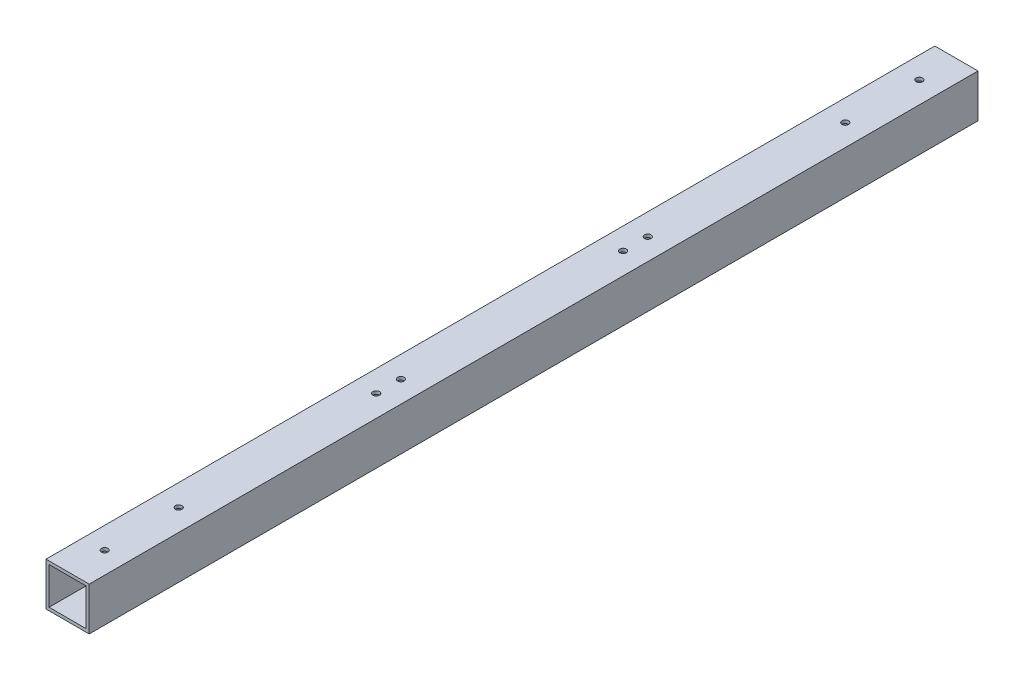
ISO-10303-21;
HEADER;
FILE_DESCRIPTION(('STEP AP214'),'2;1');
FILE_NAME('part.step','',(''),(''),'','','');
FILE_SCHEMA(('AUTOMOTIVE_DESIGN { 1 0 10303 214 1 1 1 1 }'));
ENDSEC;
DATA;
#1=APPLICATION_CONTEXT('core data for automotive mechanical design processes');
#2=APPLICATION_PROTOCOL_DEFINITION('international standard','automotive_design',2000,#1);
#3=PRODUCT_CONTEXT('',#1,'mechanical');
#4=PRODUCT('Part','Part','',(#3));
#5=PRODUCT_RELATED_PRODUCT_CATEGORY('part','',(#4));
#6=PRODUCT_DEFINITION_FORMATION('','',#4);
#7=PRODUCT_DEFINITION_CONTEXT('part definition',#1,'design');
#8=PRODUCT_DEFINITION('design','',#6,#7);
#9=PRODUCT_DEFINITION_SHAPE('','',#8);
#10=(LENGTH_UNIT() NAMED_UNIT(*) SI_UNIT(.MILLI.,.METRE.));
#11=(NAMED_UNIT(*) PLANE_ANGLE_UNIT() SI_UNIT($,.RADIAN.));
#12=(NAMED_UNIT(*) SI_UNIT($,.STERADIAN.) SOLID_ANGLE_UNIT());
#13=UNCERTAINTY_MEASURE_WITH_UNIT(LENGTH_MEASURE(1.E-05),#10,'distance_accuracy_value','');
#14=(GEOMETRIC_REPRESENTATION_CONTEXT(3) GLOBAL_UNCERTAINTY_ASSIGNED_CONTEXT((#13)) GLOBAL_UNIT_ASSIGNED_CONTEXT((#10,
#11,#12)) REPRESENTATION_CONTEXT('',''));
#15=CARTESIAN_POINT('',(0.,0.,0.));
#16=DIRECTION('',(0.,0.,1.));
#17=DIRECTION('',(1.,0.,0.));
#18=AXIS2_PLACEMENT_3D('',#15,#16,#17);
#19=CARTESIAN_POINT('',(0.,0.,914.4));
#20=DIRECTION('',(0.,0.,-1.));
#21=DIRECTION('',(-1.,0.,0.));
#22=AXIS2_PLACEMENT_3D('',#19,#20,#21);
#23=PLANE('',#22);
#24=DIRECTION('',(0.,1.,0.));
#25=VECTOR('',#24,1.);
#26=CARTESIAN_POINT('',(22.225,-22.225,914.4));
#27=LINE('',#26,#25);
#28=CARTESIAN_POINT('',(22.225,-22.225,914.4));
#29=VERTEX_POINT('',#28);
#30=CARTESIAN_POINT('',(22.225,22.225,914.4));
#31=VERTEX_POINT('',#30);
#32=EDGE_CURVE('E155',#29,#31,#27,.T.);
#33=ORIENTED_EDGE('',*,*,#32,.T.);
#34=DIRECTION('',(-1.,0.,0.));
#35=VECTOR('',#34,1.);
#36=CARTESIAN_POINT('',(-22.225,22.225,914.4));
#37=LINE('',#36,#35);
#38=CARTESIAN_POINT('',(-22.225,22.225,914.4));
#39=VERTEX_POINT('',#38);
#40=EDGE_CURVE('E158',#31,#39,#37,.T.);
#41=ORIENTED_EDGE('',*,*,#40,.T.);
#42=DIRECTION('',(0.,-1.,0.));
#43=VECTOR('',#42,1.);
#44=CARTESIAN_POINT('',(-22.225,-22.225,914.4));
#45=LINE('',#44,#43);
#46=CARTESIAN_POINT('',(-22.225,-22.225,914.4));
#47=VERTEX_POINT('',#46);
#48=EDGE_CURVE('E161',#39,#47,#45,.T.);
#49=ORIENTED_EDGE('',*,*,#48,.T.);
#50=DIRECTION('',(1.,0.,0.));
#51=VECTOR('',#50,1.);
#52=CARTESIAN_POINT('',(-22.225,-22.225,914.4));
#53=LINE('',#52,#51);
#54=EDGE_CURVE('E163',#47,#29,#53,.T.);
#55=ORIENTED_EDGE('',*,*,#54,.T.);
#56=EDGE_LOOP('',(#33,#41,#49,#55));
#57=FACE_BOUND('',#56,.T.);
#58=DIRECTION('',(0.,1.,0.));
#59=VECTOR('',#58,1.);
#60=CARTESIAN_POINT('',(19.05,-19.05,914.4));
#61=LINE('',#60,#59);
#62=CARTESIAN_POINT('',(19.05,-19.05,914.4));
#63=VERTEX_POINT('',#62);
#64=CARTESIAN_POINT('',(19.05,19.05,914.4));
#65=VERTEX_POINT('',#64);
#66=EDGE_CURVE('E113',#63,#65,#61,.T.);
#67=ORIENTED_EDGE('',*,*,#66,.F.);
#68=DIRECTION('',(1.,0.,0.));
#69=VECTOR('',#68,1.);
#70=CARTESIAN_POINT('',(-19.05,-19.05,914.4));
#71=LINE('',#70,#69);
#72=CARTESIAN_POINT('',(-19.05,-19.05,914.4));
#73=VERTEX_POINT('',#72);
#74=EDGE_CURVE('E135',#73,#63,#71,.T.);
#75=ORIENTED_EDGE('',*,*,#74,.F.);
#76=DIRECTION('',(0.,-1.,0.));
#77=VECTOR('',#76,1.);
#78=CARTESIAN_POINT('',(-19.05,-19.05,914.4));
#79=LINE('',#78,#77);
#80=CARTESIAN_POINT('',(-19.05,19.05,914.4));
#81=VERTEX_POINT('',#80);
#82=EDGE_CURVE('E133',#81,#73,#79,.T.);
#83=ORIENTED_EDGE('',*,*,#82,.F.);
#84=DIRECTION('',(-1.,0.,0.));
#85=VECTOR('',#84,1.);
#86=CARTESIAN_POINT('',(-19.05,19.05,914.4));
#87=LINE('',#86,#85);
#88=EDGE_CURVE('E121',#65,#81,#87,.T.);
#89=ORIENTED_EDGE('',*,*,#88,.F.);
#90=EDGE_LOOP('',(#67,#75,#83,#89));
#91=FACE_BOUND('',#90,.T.);
#92=ADVANCED_FACE('F38',(#57,#91),#23,.F.);
#93=CARTESIAN_POINT('',(0.,0.,0.));
#94=DIRECTION('',(0.,0.,-1.));
#95=DIRECTION('',(-1.,0.,0.));
#96=AXIS2_PLACEMENT_3D('',#93,#94,#95);
#97=PLANE('',#96);
#98=DIRECTION('',(0.,1.,0.));
#99=VECTOR('',#98,1.);
#100=CARTESIAN_POINT('',(22.225,-22.225,0.));
#101=LINE('',#100,#99);
#102=CARTESIAN_POINT('',(22.225,-22.225,0.));
#103=VERTEX_POINT('',#102);
#104=CARTESIAN_POINT('',(22.225,22.225,0.));
#105=VERTEX_POINT('',#104);
#106=EDGE_CURVE('E129',#103,#105,#101,.T.);
#107=ORIENTED_EDGE('',*,*,#106,.F.);
#108=DIRECTION('',(1.,0.,0.));
#109=VECTOR('',#108,1.);
#110=CARTESIAN_POINT('',(-22.225,-22.225,0.));
#111=LINE('',#110,#109);
#112=CARTESIAN_POINT('',(-22.225,-22.225,0.));
#113=VERTEX_POINT('',#112);
#114=EDGE_CURVE('E159',#113,#103,#111,.T.);
#115=ORIENTED_EDGE('',*,*,#114,.F.);
#116=DIRECTION('',(0.,-1.,0.));
#117=VECTOR('',#116,1.);
#118=CARTESIAN_POINT('',(-22.225,-22.225,0.));
#119=LINE('',#118,#117);
#120=CARTESIAN_POINT('',(-22.225,22.225,0.));
#121=VERTEX_POINT('',#120);
#122=EDGE_CURVE('E172',#121,#113,#119,.T.);
#123=ORIENTED_EDGE('',*,*,#122,.F.);
#124=DIRECTION('',(-1.,0.,0.));
#125=VECTOR('',#124,1.);
#126=CARTESIAN_POINT('',(-22.225,22.225,0.));
#127=LINE('',#126,#125);
#128=EDGE_CURVE('E169',#105,#121,#127,.T.);
#129=ORIENTED_EDGE('',*,*,#128,.F.);
#130=EDGE_LOOP('',(#107,#115,#123,#129));
#131=FACE_BOUND('',#130,.T.);
#132=DIRECTION('',(1.,0.,0.));
#133=VECTOR('',#132,1.);
#134=CARTESIAN_POINT('',(-19.05,-19.05,0.));
#135=LINE('',#134,#133);
#136=CARTESIAN_POINT('',(-19.05,-19.05,0.));
#137=VERTEX_POINT('',#136);
#138=CARTESIAN_POINT('',(19.05,-19.05,0.));
#139=VERTEX_POINT('',#138);
#140=EDGE_CURVE('E122',#137,#139,#135,.T.);
#141=ORIENTED_EDGE('',*,*,#140,.T.);
#142=DIRECTION('',(0.,1.,0.));
#143=VECTOR('',#142,1.);
#144=CARTESIAN_POINT('',(19.05,-19.05,0.));
#145=LINE('',#144,#143);
#146=CARTESIAN_POINT('',(19.05,19.05,0.));
#147=VERTEX_POINT('',#146);
#148=EDGE_CURVE('E66',#139,#147,#145,.T.);
#149=ORIENTED_EDGE('',*,*,#148,.T.);
#150=DIRECTION('',(-1.,0.,0.));
#151=VECTOR('',#150,1.);
#152=CARTESIAN_POINT('',(-19.05,19.05,0.));
#153=LINE('',#152,#151);
#154=CARTESIAN_POINT('',(-19.05,19.05,0.));
#155=VERTEX_POINT('',#154);
#156=EDGE_CURVE('E128',#147,#155,#153,.T.);
#157=ORIENTED_EDGE('',*,*,#156,.T.);
#158=DIRECTION('',(0.,-1.,0.));
#159=VECTOR('',#158,1.);
#160=CARTESIAN_POINT('',(-19.05,-19.05,0.));
#161=LINE('',#160,#159);
#162=EDGE_CURVE('E145',#155,#137,#161,.T.);
#163=ORIENTED_EDGE('',*,*,#162,.T.);
#164=EDGE_LOOP('',(#141,#149,#157,#163));
#165=FACE_BOUND('',#164,.T.);
#166=ADVANCED_FACE('F303',(#131,#165),#97,.T.);
#167=CARTESIAN_POINT('',(22.225,-22.225,914.4));
#168=DIRECTION('',(-1.,0.,0.));
#169=DIRECTION('',(0.,0.,1.));
#170=AXIS2_PLACEMENT_3D('',#167,#168,#169);
#171=PLANE('',#170);
#172=ORIENTED_EDGE('',*,*,#106,.T.);
#173=DIRECTION('',(0.,0.,-1.));
#174=VECTOR('',#173,1.);
#175=CARTESIAN_POINT('',(22.225,22.225,914.4));
#176=LINE('',#175,#174);
#177=EDGE_CURVE('E11',#31,#105,#176,.T.);
#178=ORIENTED_EDGE('',*,*,#177,.F.);
#179=ORIENTED_EDGE('',*,*,#32,.F.);
#180=DIRECTION('',(0.,0.,-1.));
#181=VECTOR('',#180,1.);
#182=CARTESIAN_POINT('',(22.225,-22.225,914.4));
#183=LINE('',#182,#181);
#184=EDGE_CURVE('E165',#29,#103,#183,.T.);
#185=ORIENTED_EDGE('',*,*,#184,.T.);
#186=EDGE_LOOP('',(#172,#178,#179,#185));
#187=FACE_BOUND('',#186,.T.);
#188=ADVANCED_FACE('F40',(#187),#171,.F.);
#189=CARTESIAN_POINT('',(-22.225,22.225,914.4));
#190=DIRECTION('',(0.,-1.,0.));
#191=DIRECTION('',(0.,0.,-1.));
#192=AXIS2_PLACEMENT_3D('',#189,#190,#191);
#193=PLANE('',#192);
#194=CARTESIAN_POINT('',(0.,22.225,38.1));
#195=DIRECTION('',(0.,1.,0.));
#196=DIRECTION('',(0.,0.,1.));
#197=AXIS2_PLACEMENT_3D('',#194,#195,#196);
#198=CIRCLE('',#197,3.37350099999999);
#199=CARTESIAN_POINT('',(0.,22.225,41.473501));
#200=VERTEX_POINT('',#199);
#201=EDGE_CURVE('E328',#200,#200,#198,.T.);
#202=ORIENTED_EDGE('',*,*,#201,.F.);
#203=EDGE_LOOP('',(#202));
#204=FACE_BOUND('',#203,.T.);
#205=CARTESIAN_POINT('',(1.07315799009283E-13,22.225,876.3));
#206=DIRECTION('',(0.,1.,0.));
#207=DIRECTION('',(0.,0.,1.));
#208=AXIS2_PLACEMENT_3D('',#205,#206,#207);
#209=CIRCLE('',#208,3.37350099999999);
#210=CARTESIAN_POINT('',(1.07315799009283E-13,22.225,879.673501));
#211=VERTEX_POINT('',#210);
#212=EDGE_CURVE('E225',#211,#211,#209,.T.);
#213=ORIENTED_EDGE('',*,*,#212,.F.);
#214=EDGE_LOOP('',(#213));
#215=FACE_BOUND('',#214,.T.);
#216=CARTESIAN_POINT('',(0.,22.225,317.5));
#217=DIRECTION('',(0.,1.,0.));
#218=DIRECTION('',(0.,0.,1.));
#219=AXIS2_PLACEMENT_3D('',#216,#217,#218);
#220=CIRCLE('',#219,3.37350099999999);
#221=CARTESIAN_POINT('',(0.,22.225,320.873501));
#222=VERTEX_POINT('',#221);
#223=EDGE_CURVE('E222',#222,#222,#220,.T.);
#224=ORIENTED_EDGE('',*,*,#223,.F.);
#225=EDGE_LOOP('',(#224));
#226=FACE_BOUND('',#225,.T.);
#227=CARTESIAN_POINT('',(0.,22.225,596.9));
#228=DIRECTION('',(0.,1.,0.));
#229=DIRECTION('',(0.,0.,1.));
#230=AXIS2_PLACEMENT_3D('',#227,#228,#229);
#231=CIRCLE('',#230,3.37350099999999);
#232=CARTESIAN_POINT('',(0.,22.225,600.273501));
#233=VERTEX_POINT('',#232);
#234=EDGE_CURVE('E243',#233,#233,#231,.T.);
#235=ORIENTED_EDGE('',*,*,#234,.F.);
#236=EDGE_LOOP('',(#235));
#237=FACE_BOUND('',#236,.T.);
#238=CARTESIAN_POINT('',(0.,22.225,114.3));
#239=DIRECTION('',(0.,1.,0.));
#240=DIRECTION('',(0.,0.,1.));
#241=AXIS2_PLACEMENT_3D('',#238,#239,#240);
#242=CIRCLE('',#241,3.37350099999999);
#243=CARTESIAN_POINT('',(0.,22.225,117.673501));
#244=VERTEX_POINT('',#243);
#245=EDGE_CURVE('E250',#244,#244,#242,.T.);
#246=ORIENTED_EDGE('',*,*,#245,.F.);
#247=EDGE_LOOP('',(#246));
#248=FACE_BOUND('',#247,.T.);
#249=CARTESIAN_POINT('',(0.,22.225,342.9));
#250=DIRECTION('',(0.,1.,0.));
#251=DIRECTION('',(0.,0.,1.));
#252=AXIS2_PLACEMENT_3D('',#249,#250,#251);
#253=CIRCLE('',#252,3.37350099999999);
#254=CARTESIAN_POINT('',(0.,22.225,346.273501));
#255=VERTEX_POINT('',#254);
#256=EDGE_CURVE('E260',#255,#255,#253,.T.);
#257=ORIENTED_EDGE('',*,*,#256,.F.);
#258=EDGE_LOOP('',(#257));
#259=FACE_BOUND('',#258,.T.);
#260=CARTESIAN_POINT('',(0.,22.225,571.5));
#261=DIRECTION('',(0.,1.,0.));
#262=DIRECTION('',(0.,0.,1.));
#263=AXIS2_PLACEMENT_3D('',#260,#261,#262);
#264=CIRCLE('',#263,3.37350099999999);
#265=CARTESIAN_POINT('',(0.,22.225,574.873501));
#266=VERTEX_POINT('',#265);
#267=EDGE_CURVE('E270',#266,#266,#264,.T.);
#268=ORIENTED_EDGE('',*,*,#267,.F.);
#269=EDGE_LOOP('',(#268));
#270=FACE_BOUND('',#269,.T.);
#271=CARTESIAN_POINT('',(0.,22.225,800.1));
#272=DIRECTION('',(0.,1.,0.));
#273=DIRECTION('',(0.,0.,1.));
#274=AXIS2_PLACEMENT_3D('',#271,#272,#273);
#275=CIRCLE('',#274,3.37350099999999);
#276=CARTESIAN_POINT('',(0.,22.225,803.473501));
#277=VERTEX_POINT('',#276);
#278=EDGE_CURVE('E277',#277,#277,#275,.T.);
#279=ORIENTED_EDGE('',*,*,#278,.F.);
#280=EDGE_LOOP('',(#279));
#281=FACE_BOUND('',#280,.T.);
#282=ORIENTED_EDGE('',*,*,#128,.T.);
#283=DIRECTION('',(0.,0.,-1.));
#284=VECTOR('',#283,1.);
#285=CARTESIAN_POINT('',(-22.225,22.225,914.4));
#286=LINE('',#285,#284);
#287=EDGE_CURVE('E47',#39,#121,#286,.T.);
#288=ORIENTED_EDGE('',*,*,#287,.F.);
#289=ORIENTED_EDGE('',*,*,#40,.F.);
#290=ORIENTED_EDGE('',*,*,#177,.T.);
#291=EDGE_LOOP('',(#282,#288,#289,#290));
#292=FACE_BOUND('',#291,.T.);
#293=ADVANCED_FACE('F317',(#204,#215,#226,#237,#248,#259,#270,#281,#292),#193,.F.);
#294=CARTESIAN_POINT('',(-22.225,-22.225,914.4));
#295=DIRECTION('',(1.,0.,0.));
#296=DIRECTION('',(0.,0.,-1.));
#297=AXIS2_PLACEMENT_3D('',#294,#295,#296);
#298=PLANE('',#297);
#299=ORIENTED_EDGE('',*,*,#122,.T.);
#300=DIRECTION('',(0.,0.,-1.));
#301=VECTOR('',#300,1.);
#302=CARTESIAN_POINT('',(-22.225,-22.225,914.4));
#303=LINE('',#302,#301);
#304=EDGE_CURVE('E179',#47,#113,#303,.T.);
#305=ORIENTED_EDGE('',*,*,#304,.F.);
#306=ORIENTED_EDGE('',*,*,#48,.F.);
#307=ORIENTED_EDGE('',*,*,#287,.T.);
#308=EDGE_LOOP('',(#299,#305,#306,#307));
#309=FACE_BOUND('',#308,.T.);
#310=ADVANCED_FACE('F314',(#309),#298,.F.);
#311=CARTESIAN_POINT('',(-22.225,-22.225,914.4));
#312=DIRECTION('',(0.,1.,0.));
#313=DIRECTION('',(0.,0.,1.));
#314=AXIS2_PLACEMENT_3D('',#311,#312,#313);
#315=PLANE('',#314);
#316=CARTESIAN_POINT('',(0.,-22.225,38.1));
#317=DIRECTION('',(0.,1.,0.));
#318=DIRECTION('',(0.,0.,1.));
#319=AXIS2_PLACEMENT_3D('',#316,#317,#318);
#320=CIRCLE('',#319,3.37350099999999);
#321=CARTESIAN_POINT('',(0.,-22.225,41.473501));
#322=VERTEX_POINT('',#321);
#323=EDGE_CURVE('E411',#322,#322,#320,.T.);
#324=ORIENTED_EDGE('',*,*,#323,.T.);
#325=EDGE_LOOP('',(#324));
#326=FACE_BOUND('',#325,.T.);
#327=CARTESIAN_POINT('',(1.07315799009283E-13,-22.225,876.3));
#328=DIRECTION('',(0.,1.,0.));
#329=DIRECTION('',(0.,0.,1.));
#330=AXIS2_PLACEMENT_3D('',#327,#328,#329);
#331=CIRCLE('',#330,3.37350099999999);
#332=CARTESIAN_POINT('',(1.07315799009283E-13,-22.225,879.673501));
#333=VERTEX_POINT('',#332);
#334=EDGE_CURVE('E218',#333,#333,#331,.T.);
#335=ORIENTED_EDGE('',*,*,#334,.T.);
#336=EDGE_LOOP('',(#335));
#337=FACE_BOUND('',#336,.T.);
#338=CARTESIAN_POINT('',(0.,-22.225,317.5));
#339=DIRECTION('',(0.,1.,0.));
#340=DIRECTION('',(0.,0.,1.));
#341=AXIS2_PLACEMENT_3D('',#338,#339,#340);
#342=CIRCLE('',#341,3.37350099999999);
#343=CARTESIAN_POINT('',(0.,-22.225,320.873501));
#344=VERTEX_POINT('',#343);
#345=EDGE_CURVE('E214',#344,#344,#342,.T.);
#346=ORIENTED_EDGE('',*,*,#345,.T.);
#347=EDGE_LOOP('',(#346));
#348=FACE_BOUND('',#347,.T.);
#349=CARTESIAN_POINT('',(0.,-22.225,596.9));
#350=DIRECTION('',(0.,1.,0.));
#351=DIRECTION('',(0.,0.,1.));
#352=AXIS2_PLACEMENT_3D('',#349,#350,#351);
#353=CIRCLE('',#352,3.37350099999999);
#354=CARTESIAN_POINT('',(0.,-22.225,600.273501));
#355=VERTEX_POINT('',#354);
#356=EDGE_CURVE('E209',#355,#355,#353,.T.);
#357=ORIENTED_EDGE('',*,*,#356,.T.);
#358=EDGE_LOOP('',(#357));
#359=FACE_BOUND('',#358,.T.);
#360=CARTESIAN_POINT('',(0.,-22.225,114.3));
#361=DIRECTION('',(0.,1.,0.));
#362=DIRECTION('',(0.,0.,1.));
#363=AXIS2_PLACEMENT_3D('',#360,#361,#362);
#364=CIRCLE('',#363,3.37350099999999);
#365=CARTESIAN_POINT('',(0.,-22.225,117.673501));
#366=VERTEX_POINT('',#365);
#367=EDGE_CURVE('E204',#366,#366,#364,.T.);
#368=ORIENTED_EDGE('',*,*,#367,.T.);
#369=EDGE_LOOP('',(#368));
#370=FACE_BOUND('',#369,.T.);
#371=CARTESIAN_POINT('',(0.,-22.225,342.9));
#372=DIRECTION('',(0.,1.,0.));
#373=DIRECTION('',(0.,0.,1.));
#374=AXIS2_PLACEMENT_3D('',#371,#372,#373);
#375=CIRCLE('',#374,3.37350099999999);
#376=CARTESIAN_POINT('',(0.,-22.225,346.273501));
#377=VERTEX_POINT('',#376);
#378=EDGE_CURVE('E198',#377,#377,#375,.T.);
#379=ORIENTED_EDGE('',*,*,#378,.T.);
#380=EDGE_LOOP('',(#379));
#381=FACE_BOUND('',#380,.T.);
#382=CARTESIAN_POINT('',(0.,-22.225,571.5));
#383=DIRECTION('',(0.,1.,0.));
#384=DIRECTION('',(0.,0.,1.));
#385=AXIS2_PLACEMENT_3D('',#382,#383,#384);
#386=CIRCLE('',#385,3.37350099999999);
#387=CARTESIAN_POINT('',(0.,-22.225,574.873501));
#388=VERTEX_POINT('',#387);
#389=EDGE_CURVE('E192',#388,#388,#386,.T.);
#390=ORIENTED_EDGE('',*,*,#389,.T.);
#391=EDGE_LOOP('',(#390));
#392=FACE_BOUND('',#391,.T.);
#393=CARTESIAN_POINT('',(0.,-22.225,800.1));
#394=DIRECTION('',(0.,1.,0.));
#395=DIRECTION('',(0.,0.,1.));
#396=AXIS2_PLACEMENT_3D('',#393,#394,#395);
#397=CIRCLE('',#396,3.37350099999999);
#398=CARTESIAN_POINT('',(0.,-22.225,803.473501));
#399=VERTEX_POINT('',#398);
#400=EDGE_CURVE('E187',#399,#399,#397,.T.);
#401=ORIENTED_EDGE('',*,*,#400,.T.);
#402=EDGE_LOOP('',(#401));
#403=FACE_BOUND('',#402,.T.);
#404=ORIENTED_EDGE('',*,*,#114,.T.);
#405=ORIENTED_EDGE('',*,*,#184,.F.);
#406=ORIENTED_EDGE('',*,*,#54,.F.);
#407=ORIENTED_EDGE('',*,*,#304,.T.);
#408=EDGE_LOOP('',(#404,#405,#406,#407));
#409=FACE_BOUND('',#408,.T.);
#410=ADVANCED_FACE('F298',(#326,#337,#348,#359,#370,#381,#392,#403,#409),#315,.F.);
#411=CARTESIAN_POINT('',(19.05,-19.05,914.4));
#412=DIRECTION('',(-1.,0.,0.));
#413=DIRECTION('',(0.,0.,1.));
#414=AXIS2_PLACEMENT_3D('',#411,#412,#413);
#415=PLANE('',#414);
#416=ORIENTED_EDGE('',*,*,#148,.F.);
#417=DIRECTION('',(0.,0.,-1.));
#418=VECTOR('',#417,1.);
#419=CARTESIAN_POINT('',(19.05,-19.05,914.4));
#420=LINE('',#419,#418);
#421=EDGE_CURVE('E117',#63,#139,#420,.T.);
#422=ORIENTED_EDGE('',*,*,#421,.F.);
#423=ORIENTED_EDGE('',*,*,#66,.T.);
#424=DIRECTION('',(0.,0.,-1.));
#425=VECTOR('',#424,1.);
#426=CARTESIAN_POINT('',(19.05,19.05,914.4));
#427=LINE('',#426,#425);
#428=EDGE_CURVE('E116',#65,#147,#427,.T.);
#429=ORIENTED_EDGE('',*,*,#428,.T.);
#430=EDGE_LOOP('',(#416,#422,#423,#429));
#431=FACE_BOUND('',#430,.T.);
#432=ADVANCED_FACE('F115',(#431),#415,.T.);
#433=CARTESIAN_POINT('',(-19.05,19.05,914.4));
#434=DIRECTION('',(0.,-1.,0.));
#435=DIRECTION('',(0.,0.,-1.));
#436=AXIS2_PLACEMENT_3D('',#433,#434,#435);
#437=PLANE('',#436);
#438=CARTESIAN_POINT('',(0.,19.05,38.1));
#439=DIRECTION('',(0.,-1.,0.));
#440=DIRECTION('',(0.,0.,-1.));
#441=AXIS2_PLACEMENT_3D('',#438,#439,#440);
#442=CIRCLE('',#441,3.37350099999999);
#443=CARTESIAN_POINT('',(0.,19.05,34.726499));
#444=VERTEX_POINT('',#443);
#445=EDGE_CURVE('E230',#444,#444,#442,.T.);
#446=ORIENTED_EDGE('',*,*,#445,.F.);
#447=EDGE_LOOP('',(#446));
#448=FACE_BOUND('',#447,.T.);
#449=CARTESIAN_POINT('',(1.07315799009283E-13,19.05,876.3));
#450=DIRECTION('',(0.,-1.,0.));
#451=DIRECTION('',(0.,0.,-1.));
#452=AXIS2_PLACEMENT_3D('',#449,#450,#451);
#453=CIRCLE('',#452,3.37350099999999);
#454=CARTESIAN_POINT('',(1.07315799009283E-13,19.05,872.926499));
#455=VERTEX_POINT('',#454);
#456=EDGE_CURVE('E217',#455,#455,#453,.T.);
#457=ORIENTED_EDGE('',*,*,#456,.F.);
#458=EDGE_LOOP('',(#457));
#459=FACE_BOUND('',#458,.T.);
#460=CARTESIAN_POINT('',(0.,19.05,317.5));
#461=DIRECTION('',(0.,-1.,0.));
#462=DIRECTION('',(0.,0.,-1.));
#463=AXIS2_PLACEMENT_3D('',#460,#461,#462);
#464=CIRCLE('',#463,3.37350099999999);
#465=CARTESIAN_POINT('',(0.,19.05,314.126499));
#466=VERTEX_POINT('',#465);
#467=EDGE_CURVE('E210',#466,#466,#464,.T.);
#468=ORIENTED_EDGE('',*,*,#467,.F.);
#469=EDGE_LOOP('',(#468));
#470=FACE_BOUND('',#469,.T.);
#471=CARTESIAN_POINT('',(0.,19.05,596.9));
#472=DIRECTION('',(0.,-1.,0.));
#473=DIRECTION('',(0.,0.,-1.));
#474=AXIS2_PLACEMENT_3D('',#471,#472,#473);
#475=CIRCLE('',#474,3.37350099999999);
#476=CARTESIAN_POINT('',(0.,19.05,593.526499));
#477=VERTEX_POINT('',#476);
#478=EDGE_CURVE('E208',#477,#477,#475,.T.);
#479=ORIENTED_EDGE('',*,*,#478,.F.);
#480=EDGE_LOOP('',(#479));
#481=FACE_BOUND('',#480,.T.);
#482=CARTESIAN_POINT('',(0.,19.05,114.3));
#483=DIRECTION('',(0.,-1.,0.));
#484=DIRECTION('',(0.,0.,-1.));
#485=AXIS2_PLACEMENT_3D('',#482,#483,#484);
#486=CIRCLE('',#485,3.37350099999999);
#487=CARTESIAN_POINT('',(0.,19.05,110.926499));
#488=VERTEX_POINT('',#487);
#489=EDGE_CURVE('E199',#488,#488,#486,.T.);
#490=ORIENTED_EDGE('',*,*,#489,.F.);
#491=EDGE_LOOP('',(#490));
#492=FACE_BOUND('',#491,.T.);
#493=CARTESIAN_POINT('',(0.,19.05,342.9));
#494=DIRECTION('',(0.,-1.,0.));
#495=DIRECTION('',(0.,0.,-1.));
#496=AXIS2_PLACEMENT_3D('',#493,#494,#495);
#497=CIRCLE('',#496,3.37350099999999);
#498=CARTESIAN_POINT('',(0.,19.05,339.526499));
#499=VERTEX_POINT('',#498);
#500=EDGE_CURVE('E197',#499,#499,#497,.T.);
#501=ORIENTED_EDGE('',*,*,#500,.F.);
#502=EDGE_LOOP('',(#501));
#503=FACE_BOUND('',#502,.T.);
#504=CARTESIAN_POINT('',(0.,19.05,571.5));
#505=DIRECTION('',(0.,-1.,0.));
#506=DIRECTION('',(0.,0.,-1.));
#507=AXIS2_PLACEMENT_3D('',#504,#505,#506);
#508=CIRCLE('',#507,3.37350099999999);
#509=CARTESIAN_POINT('',(0.,19.05,568.126499));
#510=VERTEX_POINT('',#509);
#511=EDGE_CURVE('E191',#510,#510,#508,.T.);
#512=ORIENTED_EDGE('',*,*,#511,.F.);
#513=EDGE_LOOP('',(#512));
#514=FACE_BOUND('',#513,.T.);
#515=CARTESIAN_POINT('',(0.,19.05,800.1));
#516=DIRECTION('',(0.,-1.,0.));
#517=DIRECTION('',(0.,0.,-1.));
#518=AXIS2_PLACEMENT_3D('',#515,#516,#517);
#519=CIRCLE('',#518,3.37350099999999);
#520=CARTESIAN_POINT('',(0.,19.05,796.726499));
#521=VERTEX_POINT('',#520);
#522=EDGE_CURVE('E142',#521,#521,#519,.T.);
#523=ORIENTED_EDGE('',*,*,#522,.F.);
#524=EDGE_LOOP('',(#523));
#525=FACE_BOUND('',#524,.T.);
#526=ORIENTED_EDGE('',*,*,#156,.F.);
#527=ORIENTED_EDGE('',*,*,#428,.F.);
#528=ORIENTED_EDGE('',*,*,#88,.T.);
#529=DIRECTION('',(0.,0.,-1.));
#530=VECTOR('',#529,1.);
#531=CARTESIAN_POINT('',(-19.05,19.05,914.4));
#532=LINE('',#531,#530);
#533=EDGE_CURVE('E130',#81,#155,#532,.T.);
#534=ORIENTED_EDGE('',*,*,#533,.T.);
#535=EDGE_LOOP('',(#526,#527,#528,#534));
#536=FACE_BOUND('',#535,.T.);
#537=ADVANCED_FACE('F125',(#448,#459,#470,#481,#492,#503,#514,#525,#536),#437,.T.);
#538=CARTESIAN_POINT('',(-19.05,-19.05,914.4));
#539=DIRECTION('',(1.,0.,0.));
#540=DIRECTION('',(0.,0.,-1.));
#541=AXIS2_PLACEMENT_3D('',#538,#539,#540);
#542=PLANE('',#541);
#543=ORIENTED_EDGE('',*,*,#162,.F.);
#544=ORIENTED_EDGE('',*,*,#533,.F.);
#545=ORIENTED_EDGE('',*,*,#82,.T.);
#546=DIRECTION('',(0.,0.,-1.));
#547=VECTOR('',#546,1.);
#548=CARTESIAN_POINT('',(-19.05,-19.05,914.4));
#549=LINE('',#548,#547);
#550=EDGE_CURVE('E55',#73,#137,#549,.T.);
#551=ORIENTED_EDGE('',*,*,#550,.T.);
#552=EDGE_LOOP('',(#543,#544,#545,#551));
#553=FACE_BOUND('',#552,.T.);
#554=ADVANCED_FACE('F288',(#553),#542,.T.);
#555=CARTESIAN_POINT('',(-19.05,-19.05,914.4));
#556=DIRECTION('',(0.,1.,0.));
#557=DIRECTION('',(0.,0.,1.));
#558=AXIS2_PLACEMENT_3D('',#555,#556,#557);
#559=PLANE('',#558);
#560=CARTESIAN_POINT('',(0.,-19.05,38.1));
#561=DIRECTION('',(0.,1.,0.));
#562=DIRECTION('',(0.,0.,1.));
#563=AXIS2_PLACEMENT_3D('',#560,#561,#562);
#564=CIRCLE('',#563,3.37350099999999);
#565=CARTESIAN_POINT('',(0.,-19.05,41.473501));
#566=VERTEX_POINT('',#565);
#567=EDGE_CURVE('E42',#566,#566,#564,.T.);
#568=ORIENTED_EDGE('',*,*,#567,.F.);
#569=EDGE_LOOP('',(#568));
#570=FACE_BOUND('',#569,.T.);
#571=CARTESIAN_POINT('',(1.07315799009283E-13,-19.05,876.3));
#572=DIRECTION('',(0.,1.,0.));
#573=DIRECTION('',(0.,0.,1.));
#574=AXIS2_PLACEMENT_3D('',#571,#572,#573);
#575=CIRCLE('',#574,3.37350099999999);
#576=CARTESIAN_POINT('',(1.07315799009283E-13,-19.05,879.673501));
#577=VERTEX_POINT('',#576);
#578=EDGE_CURVE('E215',#577,#577,#575,.T.);
#579=ORIENTED_EDGE('',*,*,#578,.F.);
#580=EDGE_LOOP('',(#579));
#581=FACE_BOUND('',#580,.T.);
#582=CARTESIAN_POINT('',(0.,-19.05,317.5));
#583=DIRECTION('',(0.,1.,0.));
#584=DIRECTION('',(0.,0.,1.));
#585=AXIS2_PLACEMENT_3D('',#582,#583,#584);
#586=CIRCLE('',#585,3.37350099999999);
#587=CARTESIAN_POINT('',(0.,-19.05,320.873501));
#588=VERTEX_POINT('',#587);
#589=EDGE_CURVE('E213',#588,#588,#586,.T.);
#590=ORIENTED_EDGE('',*,*,#589,.F.);
#591=EDGE_LOOP('',(#590));
#592=FACE_BOUND('',#591,.T.);
#593=CARTESIAN_POINT('',(0.,-19.05,596.9));
#594=DIRECTION('',(0.,1.,0.));
#595=DIRECTION('',(0.,0.,1.));
#596=AXIS2_PLACEMENT_3D('',#593,#594,#595);
#597=CIRCLE('',#596,3.37350099999999);
#598=CARTESIAN_POINT('',(0.,-19.05,600.273501));
#599=VERTEX_POINT('',#598);
#600=EDGE_CURVE('E205',#599,#599,#597,.T.);
#601=ORIENTED_EDGE('',*,*,#600,.F.);
#602=EDGE_LOOP('',(#601));
#603=FACE_BOUND('',#602,.T.);
#604=CARTESIAN_POINT('',(0.,-19.05,114.3));
#605=DIRECTION('',(0.,1.,0.));
#606=DIRECTION('',(0.,0.,1.));
#607=AXIS2_PLACEMENT_3D('',#604,#605,#606);
#608=CIRCLE('',#607,3.37350099999999);
#609=CARTESIAN_POINT('',(0.,-19.05,117.673501));
#610=VERTEX_POINT('',#609);
#611=EDGE_CURVE('E203',#610,#610,#608,.T.);
#612=ORIENTED_EDGE('',*,*,#611,.F.);
#613=EDGE_LOOP('',(#612));
#614=FACE_BOUND('',#613,.T.);
#615=CARTESIAN_POINT('',(0.,-19.05,342.9));
#616=DIRECTION('',(0.,1.,0.));
#617=DIRECTION('',(0.,0.,1.));
#618=AXIS2_PLACEMENT_3D('',#615,#616,#617);
#619=CIRCLE('',#618,3.37350099999999);
#620=CARTESIAN_POINT('',(0.,-19.05,346.273501));
#621=VERTEX_POINT('',#620);
#622=EDGE_CURVE('E193',#621,#621,#619,.T.);
#623=ORIENTED_EDGE('',*,*,#622,.F.);
#624=EDGE_LOOP('',(#623));
#625=FACE_BOUND('',#624,.T.);
#626=CARTESIAN_POINT('',(0.,-19.05,571.5));
#627=DIRECTION('',(0.,1.,0.));
#628=DIRECTION('',(0.,0.,1.));
#629=AXIS2_PLACEMENT_3D('',#626,#627,#628);
#630=CIRCLE('',#629,3.37350099999999);
#631=CARTESIAN_POINT('',(0.,-19.05,574.873501));
#632=VERTEX_POINT('',#631);
#633=EDGE_CURVE('E188',#632,#632,#630,.T.);
#634=ORIENTED_EDGE('',*,*,#633,.F.);
#635=EDGE_LOOP('',(#634));
#636=FACE_BOUND('',#635,.T.);
#637=CARTESIAN_POINT('',(0.,-19.05,800.1));
#638=DIRECTION('',(0.,1.,0.));
#639=DIRECTION('',(0.,0.,1.));
#640=AXIS2_PLACEMENT_3D('',#637,#638,#639);
#641=CIRCLE('',#640,3.37350099999999);
#642=CARTESIAN_POINT('',(0.,-19.05,803.473501));
#643=VERTEX_POINT('',#642);
#644=EDGE_CURVE('E184',#643,#643,#641,.T.);
#645=ORIENTED_EDGE('',*,*,#644,.F.);
#646=EDGE_LOOP('',(#645));
#647=FACE_BOUND('',#646,.T.);
#648=ORIENTED_EDGE('',*,*,#140,.F.);
#649=ORIENTED_EDGE('',*,*,#550,.F.);
#650=ORIENTED_EDGE('',*,*,#74,.T.);
#651=ORIENTED_EDGE('',*,*,#421,.T.);
#652=EDGE_LOOP('',(#648,#649,#650,#651));
#653=FACE_BOUND('',#652,.T.);
#654=ADVANCED_FACE('F295',(#570,#581,#592,#603,#614,#625,#636,#647,#653),#559,.T.);
#655=CARTESIAN_POINT('',(0.,22.225,800.1));
#656=DIRECTION('',(0.,1.,0.));
#657=DIRECTION('',(0.,0.,1.));
#658=AXIS2_PLACEMENT_3D('',#655,#656,#657);
#659=CYLINDRICAL_SURFACE('',#658,3.37350099999999);
#660=ORIENTED_EDGE('',*,*,#644,.T.);
#661=EDGE_LOOP('',(#660));
#662=FACE_BOUND('',#661,.T.);
#663=ORIENTED_EDGE('',*,*,#400,.F.);
#664=EDGE_LOOP('',(#663));
#665=FACE_BOUND('',#664,.T.);
#666=ADVANCED_FACE('F357',(#662,#665),#659,.F.);
#667=ORIENTED_EDGE('',*,*,#522,.T.);
#668=EDGE_LOOP('',(#667));
#669=FACE_BOUND('',#668,.T.);
#670=ORIENTED_EDGE('',*,*,#278,.T.);
#671=EDGE_LOOP('',(#670));
#672=FACE_BOUND('',#671,.T.);
#673=ADVANCED_FACE('F284',(#669,#672),#659,.F.);
#674=CARTESIAN_POINT('',(0.,22.225,571.5));
#675=DIRECTION('',(0.,1.,0.));
#676=DIRECTION('',(0.,0.,1.));
#677=AXIS2_PLACEMENT_3D('',#674,#675,#676);
#678=CYLINDRICAL_SURFACE('',#677,3.37350099999999);
#679=ORIENTED_EDGE('',*,*,#633,.T.);
#680=EDGE_LOOP('',(#679));
#681=FACE_BOUND('',#680,.T.);
#682=ORIENTED_EDGE('',*,*,#389,.F.);
#683=EDGE_LOOP('',(#682));
#684=FACE_BOUND('',#683,.T.);
#685=ADVANCED_FACE('F368',(#681,#684),#678,.F.);
#686=ORIENTED_EDGE('',*,*,#511,.T.);
#687=EDGE_LOOP('',(#686));
#688=FACE_BOUND('',#687,.T.);
#689=ORIENTED_EDGE('',*,*,#267,.T.);
#690=EDGE_LOOP('',(#689));
#691=FACE_BOUND('',#690,.T.);
#692=ADVANCED_FACE('F371',(#688,#691),#678,.F.);
#693=CARTESIAN_POINT('',(0.,22.225,342.9));
#694=DIRECTION('',(0.,1.,0.));
#695=DIRECTION('',(0.,0.,1.));
#696=AXIS2_PLACEMENT_3D('',#693,#694,#695);
#697=CYLINDRICAL_SURFACE('',#696,3.37350099999999);
#698=ORIENTED_EDGE('',*,*,#622,.T.);
#699=EDGE_LOOP('',(#698));
#700=FACE_BOUND('',#699,.T.);
#701=ORIENTED_EDGE('',*,*,#378,.F.);
#702=EDGE_LOOP('',(#701));
#703=FACE_BOUND('',#702,.T.);
#704=ADVANCED_FACE('F373',(#700,#703),#697,.F.);
#705=ORIENTED_EDGE('',*,*,#500,.T.);
#706=EDGE_LOOP('',(#705));
#707=FACE_BOUND('',#706,.T.);
#708=ORIENTED_EDGE('',*,*,#256,.T.);
#709=EDGE_LOOP('',(#708));
#710=FACE_BOUND('',#709,.T.);
#711=ADVANCED_FACE('F376',(#707,#710),#697,.F.);
#712=CARTESIAN_POINT('',(0.,22.225,114.3));
#713=DIRECTION('',(0.,1.,0.));
#714=DIRECTION('',(0.,0.,1.));
#715=AXIS2_PLACEMENT_3D('',#712,#713,#714);
#716=CYLINDRICAL_SURFACE('',#715,3.37350099999999);
#717=ORIENTED_EDGE('',*,*,#489,.T.);
#718=EDGE_LOOP('',(#717));
#719=FACE_BOUND('',#718,.T.);
#720=ORIENTED_EDGE('',*,*,#245,.T.);
#721=EDGE_LOOP('',(#720));
#722=FACE_BOUND('',#721,.T.);
#723=ADVANCED_FACE('F378',(#719,#722),#716,.F.);
#724=ORIENTED_EDGE('',*,*,#611,.T.);
#725=EDGE_LOOP('',(#724));
#726=FACE_BOUND('',#725,.T.);
#727=ORIENTED_EDGE('',*,*,#367,.F.);
#728=EDGE_LOOP('',(#727));
#729=FACE_BOUND('',#728,.T.);
#730=ADVANCED_FACE('F381',(#726,#729),#716,.F.);
#731=CARTESIAN_POINT('',(0.,22.225,596.9));
#732=DIRECTION('',(0.,1.,0.));
#733=DIRECTION('',(0.,0.,1.));
#734=AXIS2_PLACEMENT_3D('',#731,#732,#733);
#735=CYLINDRICAL_SURFACE('',#734,3.37350099999999);
#736=ORIENTED_EDGE('',*,*,#600,.T.);
#737=EDGE_LOOP('',(#736));
#738=FACE_BOUND('',#737,.T.);
#739=ORIENTED_EDGE('',*,*,#356,.F.);
#740=EDGE_LOOP('',(#739));
#741=FACE_BOUND('',#740,.T.);
#742=ADVANCED_FACE('F383',(#738,#741),#735,.F.);
#743=ORIENTED_EDGE('',*,*,#478,.T.);
#744=EDGE_LOOP('',(#743));
#745=FACE_BOUND('',#744,.T.);
#746=ORIENTED_EDGE('',*,*,#234,.T.);
#747=EDGE_LOOP('',(#746));
#748=FACE_BOUND('',#747,.T.);
#749=ADVANCED_FACE('F386',(#745,#748),#735,.F.);
#750=CARTESIAN_POINT('',(0.,22.225,317.5));
#751=DIRECTION('',(0.,1.,0.));
#752=DIRECTION('',(0.,0.,1.));
#753=AXIS2_PLACEMENT_3D('',#750,#751,#752);
#754=CYLINDRICAL_SURFACE('',#753,3.37350099999999);
#755=ORIENTED_EDGE('',*,*,#467,.T.);
#756=EDGE_LOOP('',(#755));
#757=FACE_BOUND('',#756,.T.);
#758=ORIENTED_EDGE('',*,*,#223,.T.);
#759=EDGE_LOOP('',(#758));
#760=FACE_BOUND('',#759,.T.);
#761=ADVANCED_FACE('F388',(#757,#760),#754,.F.);
#762=ORIENTED_EDGE('',*,*,#589,.T.);
#763=EDGE_LOOP('',(#762));
#764=FACE_BOUND('',#763,.T.);
#765=ORIENTED_EDGE('',*,*,#345,.F.);
#766=EDGE_LOOP('',(#765));
#767=FACE_BOUND('',#766,.T.);
#768=ADVANCED_FACE('F391',(#764,#767),#754,.F.);
#769=CARTESIAN_POINT('',(1.07315799009283E-13,22.225,876.3));
#770=DIRECTION('',(0.,1.,0.));
#771=DIRECTION('',(0.,0.,1.));
#772=AXIS2_PLACEMENT_3D('',#769,#770,#771);
#773=CYLINDRICAL_SURFACE('',#772,3.37350099999999);
#774=ORIENTED_EDGE('',*,*,#578,.T.);
#775=EDGE_LOOP('',(#774));
#776=FACE_BOUND('',#775,.T.);
#777=ORIENTED_EDGE('',*,*,#334,.F.);
#778=EDGE_LOOP('',(#777));
#779=FACE_BOUND('',#778,.T.);
#780=ADVANCED_FACE('F393',(#776,#779),#773,.F.);
#781=ORIENTED_EDGE('',*,*,#456,.T.);
#782=EDGE_LOOP('',(#781));
#783=FACE_BOUND('',#782,.T.);
#784=ORIENTED_EDGE('',*,*,#212,.T.);
#785=EDGE_LOOP('',(#784));
#786=FACE_BOUND('',#785,.T.);
#787=ADVANCED_FACE('F396',(#783,#786),#773,.F.);
#788=CARTESIAN_POINT('',(0.,22.225,38.1));
#789=DIRECTION('',(0.,1.,0.));
#790=DIRECTION('',(0.,0.,1.));
#791=AXIS2_PLACEMENT_3D('',#788,#789,#790);
#792=CYLINDRICAL_SURFACE('',#791,3.37350099999999);
#793=ORIENTED_EDGE('',*,*,#567,.T.);
#794=EDGE_LOOP('',(#793));
#795=FACE_BOUND('',#794,.T.);
#796=ORIENTED_EDGE('',*,*,#323,.F.);
#797=EDGE_LOOP('',(#796));
#798=FACE_BOUND('',#797,.T.);
#799=ADVANCED_FACE('F397',(#795,#798),#792,.F.);
#800=ORIENTED_EDGE('',*,*,#445,.T.);
#801=EDGE_LOOP('',(#800));
#802=FACE_BOUND('',#801,.T.);
#803=ORIENTED_EDGE('',*,*,#201,.T.);
#804=EDGE_LOOP('',(#803));
#805=FACE_BOUND('',#804,.T.);
#806=ADVANCED_FACE('F399',(#802,#805),#792,.F.);
#807=CLOSED_SHELL('',(#92,#166,#188,#293,#310,#410,#432,#537,#554,#654,#666,#673,#685,#692,#704,
#711,#723,#730,#742,#749,#761,#768,#780,#787,#799,#806));
#808=MANIFOLD_SOLID_BREP('B2',#807);
#809=ADVANCED_BREP_SHAPE_REPRESENTATION('',(#18,#808),#14);
#810=SHAPE_DEFINITION_REPRESENTATION(#9,#809);
ENDSEC;
END-ISO-10303-21;
